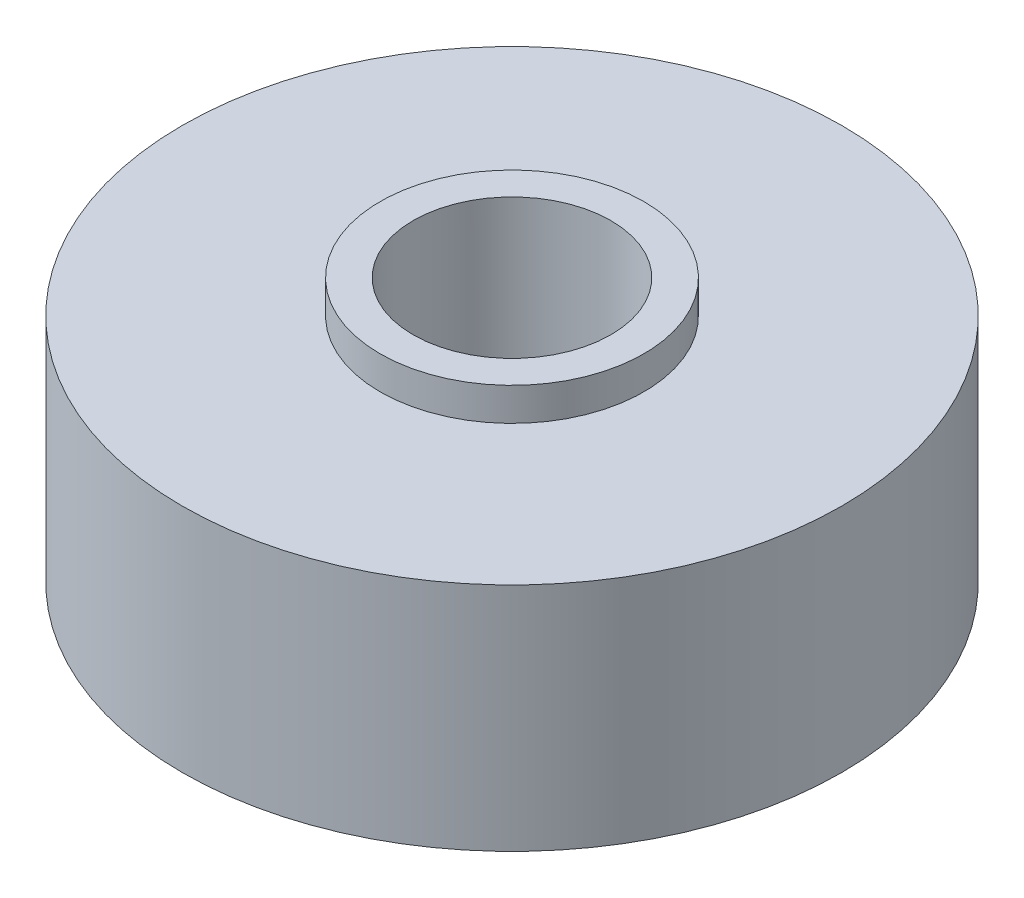
ISO-10303-21;
HEADER;
FILE_DESCRIPTION(('STEP AP214'),'2;1');
FILE_NAME('part.step','',(''),(''),'','','');
FILE_SCHEMA(('AUTOMOTIVE_DESIGN { 1 0 10303 214 1 1 1 1 }'));
ENDSEC;
DATA;
#1=APPLICATION_CONTEXT('core data for automotive mechanical design processes');
#2=APPLICATION_PROTOCOL_DEFINITION('international standard','automotive_design',2000,#1);
#3=PRODUCT_CONTEXT('',#1,'mechanical');
#4=PRODUCT('Part','Part','',(#3));
#5=PRODUCT_RELATED_PRODUCT_CATEGORY('part','',(#4));
#6=PRODUCT_DEFINITION_FORMATION('','',#4);
#7=PRODUCT_DEFINITION_CONTEXT('part definition',#1,'design');
#8=PRODUCT_DEFINITION('design','',#6,#7);
#9=PRODUCT_DEFINITION_SHAPE('','',#8);
#10=(LENGTH_UNIT() NAMED_UNIT(*) SI_UNIT(.MILLI.,.METRE.));
#11=(NAMED_UNIT(*) PLANE_ANGLE_UNIT() SI_UNIT($,.RADIAN.));
#12=(NAMED_UNIT(*) SI_UNIT($,.STERADIAN.) SOLID_ANGLE_UNIT());
#13=UNCERTAINTY_MEASURE_WITH_UNIT(LENGTH_MEASURE(1.E-05),#10,'distance_accuracy_value','');
#14=(GEOMETRIC_REPRESENTATION_CONTEXT(3) GLOBAL_UNCERTAINTY_ASSIGNED_CONTEXT((#13)) GLOBAL_UNIT_ASSIGNED_CONTEXT((#10,
#11,#12)) REPRESENTATION_CONTEXT('',''));
#15=CARTESIAN_POINT('',(0.,0.,0.));
#16=DIRECTION('',(0.,0.,1.));
#17=DIRECTION('',(1.,0.,0.));
#18=AXIS2_PLACEMENT_3D('',#15,#16,#17);
#19=CARTESIAN_POINT('',(0.,0.,0.));
#20=DIRECTION('',(0.,1.,0.));
#21=DIRECTION('',(0.,0.,1.));
#22=AXIS2_PLACEMENT_3D('',#19,#20,#21);
#23=PLANE('',#22);
#24=CARTESIAN_POINT('',(0.,0.,0.));
#25=DIRECTION('',(0.,1.,0.));
#26=DIRECTION('',(0.,0.,1.));
#27=AXIS2_PLACEMENT_3D('',#24,#25,#26);
#28=CIRCLE('',#27,10.);
#29=CARTESIAN_POINT('',(0.,0.,10.));
#30=VERTEX_POINT('',#29);
#31=EDGE_CURVE('E41',#30,#30,#28,.T.);
#32=ORIENTED_EDGE('',*,*,#31,.F.);
#33=EDGE_LOOP('',(#32));
#34=FACE_BOUND('',#33,.T.);
#35=CARTESIAN_POINT('',(0.,0.,0.));
#36=DIRECTION('',(0.,1.,0.));
#37=DIRECTION('',(0.,0.,1.));
#38=AXIS2_PLACEMENT_3D('',#35,#36,#37);
#39=CIRCLE('',#38,4.);
#40=CARTESIAN_POINT('',(0.,0.,4.));
#41=VERTEX_POINT('',#40);
#42=EDGE_CURVE('E10',#41,#41,#39,.F.);
#43=ORIENTED_EDGE('',*,*,#42,.F.);
#44=EDGE_LOOP('',(#43));
#45=FACE_BOUND('',#44,.T.);
#46=ADVANCED_FACE('F30',(#34,#45),#23,.F.);
#47=CARTESIAN_POINT('',(0.,7.,0.));
#48=DIRECTION('',(0.,1.,0.));
#49=DIRECTION('',(0.,0.,1.));
#50=AXIS2_PLACEMENT_3D('',#47,#48,#49);
#51=PLANE('',#50);
#52=CARTESIAN_POINT('',(0.,7.,0.));
#53=DIRECTION('',(0.,1.,0.));
#54=DIRECTION('',(0.,0.,1.));
#55=AXIS2_PLACEMENT_3D('',#52,#53,#54);
#56=CIRCLE('',#55,10.);
#57=CARTESIAN_POINT('',(0.,7.,10.));
#58=VERTEX_POINT('',#57);
#59=EDGE_CURVE('E37',#58,#58,#56,.T.);
#60=ORIENTED_EDGE('',*,*,#59,.T.);
#61=EDGE_LOOP('',(#60));
#62=FACE_BOUND('',#61,.T.);
#63=CARTESIAN_POINT('',(0.,7.,0.));
#64=DIRECTION('',(0.,1.,0.));
#65=DIRECTION('',(0.,0.,1.));
#66=AXIS2_PLACEMENT_3D('',#63,#64,#65);
#67=CIRCLE('',#66,4.);
#68=CARTESIAN_POINT('',(0.,7.,4.));
#69=VERTEX_POINT('',#68);
#70=EDGE_CURVE('E48',#69,#69,#67,.T.);
#71=ORIENTED_EDGE('',*,*,#70,.F.);
#72=EDGE_LOOP('',(#71));
#73=FACE_BOUND('',#72,.T.);
#74=ADVANCED_FACE('F80',(#62,#73),#51,.T.);
#75=CARTESIAN_POINT('',(0.,7.,0.));
#76=DIRECTION('',(0.,-1.,0.));
#77=DIRECTION('',(0.,0.,-1.));
#78=AXIS2_PLACEMENT_3D('',#75,#76,#77);
#79=CYLINDRICAL_SURFACE('',#78,10.);
#80=ORIENTED_EDGE('',*,*,#59,.F.);
#81=EDGE_LOOP('',(#80));
#82=FACE_BOUND('',#81,.T.);
#83=ORIENTED_EDGE('',*,*,#31,.T.);
#84=EDGE_LOOP('',(#83));
#85=FACE_BOUND('',#84,.T.);
#86=ADVANCED_FACE('F32',(#82,#85),#79,.T.);
#87=CARTESIAN_POINT('',(0.,8.,0.));
#88=DIRECTION('',(0.,1.,0.));
#89=DIRECTION('',(0.,0.,1.));
#90=AXIS2_PLACEMENT_3D('',#87,#88,#89);
#91=PLANE('',#90);
#92=CARTESIAN_POINT('',(0.,8.,0.));
#93=DIRECTION('',(0.,1.,0.));
#94=DIRECTION('',(0.,0.,1.));
#95=AXIS2_PLACEMENT_3D('',#92,#93,#94);
#96=CIRCLE('',#95,4.);
#97=CARTESIAN_POINT('',(0.,8.,4.));
#98=VERTEX_POINT('',#97);
#99=EDGE_CURVE('E46',#98,#98,#96,.T.);
#100=ORIENTED_EDGE('',*,*,#99,.T.);
#101=EDGE_LOOP('',(#100));
#102=FACE_BOUND('',#101,.T.);
#103=CARTESIAN_POINT('',(0.,8.,0.));
#104=DIRECTION('',(0.,1.,0.));
#105=DIRECTION('',(0.,0.,1.));
#106=AXIS2_PLACEMENT_3D('',#103,#104,#105);
#107=CIRCLE('',#106,3.);
#108=CARTESIAN_POINT('',(0.,8.,3.));
#109=VERTEX_POINT('',#108);
#110=EDGE_CURVE('E51',#109,#109,#107,.T.);
#111=ORIENTED_EDGE('',*,*,#110,.F.);
#112=EDGE_LOOP('',(#111));
#113=FACE_BOUND('',#112,.T.);
#114=ADVANCED_FACE('F91',(#102,#113),#91,.T.);
#115=CARTESIAN_POINT('',(0.,8.,0.));
#116=DIRECTION('',(0.,-1.,0.));
#117=DIRECTION('',(0.,0.,-1.));
#118=AXIS2_PLACEMENT_3D('',#115,#116,#117);
#119=CYLINDRICAL_SURFACE('',#118,4.);
#120=ORIENTED_EDGE('',*,*,#99,.F.);
#121=EDGE_LOOP('',(#120));
#122=FACE_BOUND('',#121,.T.);
#123=ORIENTED_EDGE('',*,*,#70,.T.);
#124=EDGE_LOOP('',(#123));
#125=FACE_BOUND('',#124,.T.);
#126=ADVANCED_FACE('F76',(#122,#125),#119,.T.);
#127=CARTESIAN_POINT('',(0.,8.,0.));
#128=DIRECTION('',(0.,-1.,0.));
#129=DIRECTION('',(0.,0.,-1.));
#130=AXIS2_PLACEMENT_3D('',#127,#128,#129);
#131=CYLINDRICAL_SURFACE('',#130,3.);
#132=ORIENTED_EDGE('',*,*,#110,.T.);
#133=EDGE_LOOP('',(#132));
#134=FACE_BOUND('',#133,.T.);
#135=CARTESIAN_POINT('',(0.,-1.,0.));
#136=DIRECTION('',(0.,-1.,0.));
#137=DIRECTION('',(0.,0.,-1.));
#138=AXIS2_PLACEMENT_3D('',#135,#136,#137);
#139=CIRCLE('',#138,3.);
#140=CARTESIAN_POINT('',(0.,-1.,-3.));
#141=VERTEX_POINT('',#140);
#142=EDGE_CURVE('E59',#141,#141,#139,.T.);
#143=ORIENTED_EDGE('',*,*,#142,.T.);
#144=EDGE_LOOP('',(#143));
#145=FACE_BOUND('',#144,.T.);
#146=ADVANCED_FACE('F63',(#134,#145),#131,.F.);
#147=CARTESIAN_POINT('',(0.,-1.,0.));
#148=DIRECTION('',(0.,-1.,0.));
#149=DIRECTION('',(0.,0.,-1.));
#150=AXIS2_PLACEMENT_3D('',#147,#148,#149);
#151=PLANE('',#150);
#152=CARTESIAN_POINT('',(0.,-1.,0.));
#153=DIRECTION('',(0.,-1.,0.));
#154=DIRECTION('',(0.,0.,-1.));
#155=AXIS2_PLACEMENT_3D('',#152,#153,#154);
#156=CIRCLE('',#155,4.);
#157=CARTESIAN_POINT('',(0.,-1.,-4.));
#158=VERTEX_POINT('',#157);
#159=EDGE_CURVE('E56',#158,#158,#156,.T.);
#160=ORIENTED_EDGE('',*,*,#159,.T.);
#161=EDGE_LOOP('',(#160));
#162=FACE_BOUND('',#161,.T.);
#163=ORIENTED_EDGE('',*,*,#142,.F.);
#164=EDGE_LOOP('',(#163));
#165=FACE_BOUND('',#164,.T.);
#166=ADVANCED_FACE('F65',(#162,#165),#151,.T.);
#167=CARTESIAN_POINT('',(0.,-1.,0.));
#168=DIRECTION('',(0.,1.,0.));
#169=DIRECTION('',(0.,0.,1.));
#170=AXIS2_PLACEMENT_3D('',#167,#168,#169);
#171=CYLINDRICAL_SURFACE('',#170,4.);
#172=ORIENTED_EDGE('',*,*,#159,.F.);
#173=EDGE_LOOP('',(#172));
#174=FACE_BOUND('',#173,.T.);
#175=ORIENTED_EDGE('',*,*,#42,.T.);
#176=EDGE_LOOP('',(#175));
#177=FACE_BOUND('',#176,.T.);
#178=ADVANCED_FACE('F67',(#174,#177),#171,.T.);
#179=CLOSED_SHELL('',(#46,#74,#86,#114,#126,#146,#166,#178));
#180=MANIFOLD_SOLID_BREP('B2',#179);
#181=ADVANCED_BREP_SHAPE_REPRESENTATION('',(#18,#180),#14);
#182=SHAPE_DEFINITION_REPRESENTATION(#9,#181);
ENDSEC;
END-ISO-10303-21;
